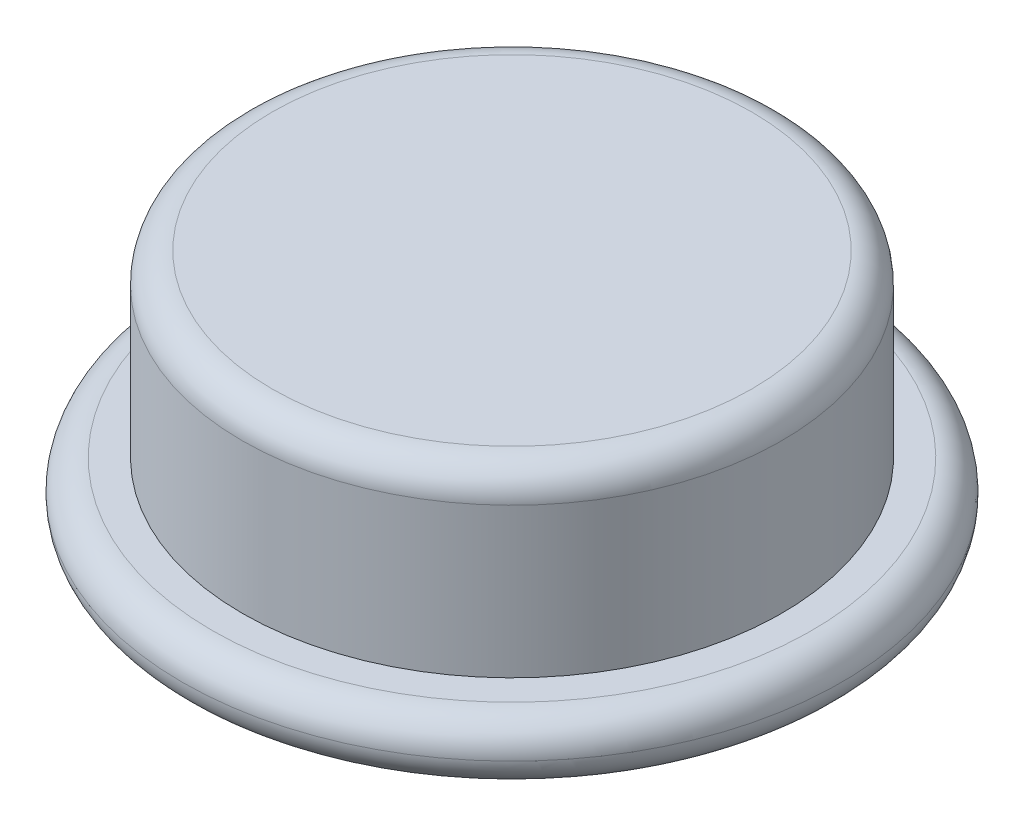
ISO-10303-21;
HEADER;
FILE_DESCRIPTION(('STEP AP214'),'2;1');
FILE_NAME('part.step','',(''),(''),'','','');
FILE_SCHEMA(('AUTOMOTIVE_DESIGN { 1 0 10303 214 1 1 1 1 }'));
ENDSEC;
DATA;
#1=APPLICATION_CONTEXT('core data for automotive mechanical design processes');
#2=APPLICATION_PROTOCOL_DEFINITION('international standard','automotive_design',2000,#1);
#3=PRODUCT_CONTEXT('',#1,'mechanical');
#4=PRODUCT('Part','Part','',(#3));
#5=PRODUCT_RELATED_PRODUCT_CATEGORY('part','',(#4));
#6=PRODUCT_DEFINITION_FORMATION('','',#4);
#7=PRODUCT_DEFINITION_CONTEXT('part definition',#1,'design');
#8=PRODUCT_DEFINITION('design','',#6,#7);
#9=PRODUCT_DEFINITION_SHAPE('','',#8);
#10=(LENGTH_UNIT() NAMED_UNIT(*) SI_UNIT(.MILLI.,.METRE.));
#11=(NAMED_UNIT(*) PLANE_ANGLE_UNIT() SI_UNIT($,.RADIAN.));
#12=(NAMED_UNIT(*) SI_UNIT($,.STERADIAN.) SOLID_ANGLE_UNIT());
#13=UNCERTAINTY_MEASURE_WITH_UNIT(LENGTH_MEASURE(1.E-05),#10,'distance_accuracy_value','');
#14=(GEOMETRIC_REPRESENTATION_CONTEXT(3) GLOBAL_UNCERTAINTY_ASSIGNED_CONTEXT((#13)) GLOBAL_UNIT_ASSIGNED_CONTEXT((#10,
#11,#12)) REPRESENTATION_CONTEXT('',''));
#15=CARTESIAN_POINT('',(0.,0.,0.));
#16=DIRECTION('',(0.,0.,1.));
#17=DIRECTION('',(1.,0.,0.));
#18=AXIS2_PLACEMENT_3D('',#15,#16,#17);
#19=CARTESIAN_POINT('',(0.,0.,5.5125));
#20=DIRECTION('',(0.,-1.,0.));
#21=DIRECTION('',(0.,0.,-1.));
#22=AXIS2_PLACEMENT_3D('',#19,#20,#21);
#23=PLANE('',#22);
#24=CARTESIAN_POINT('',(0.,0.,0.));
#25=DIRECTION('',(0.,-1.,0.));
#26=DIRECTION('',(0.,0.,-1.));
#27=AXIS2_PLACEMENT_3D('',#24,#25,#26);
#28=CIRCLE('',#27,5.0125);
#29=CARTESIAN_POINT('',(0.,0.,-5.0125));
#30=VERTEX_POINT('',#29);
#31=EDGE_CURVE('E48',#30,#30,#28,.T.);
#32=ORIENTED_EDGE('',*,*,#31,.T.);
#33=EDGE_LOOP('',(#32));
#34=FACE_BOUND('',#33,.T.);
#35=ADVANCED_FACE('F31',(#34),#23,.T.);
#36=CARTESIAN_POINT('',(0.,4.,0.));
#37=DIRECTION('',(0.,1.,0.));
#38=DIRECTION('',(0.,0.,1.));
#39=AXIS2_PLACEMENT_3D('',#36,#37,#38);
#40=PLANE('',#39);
#41=CARTESIAN_POINT('',(0.,4.,0.));
#42=DIRECTION('',(0.,1.,0.));
#43=DIRECTION('',(0.,0.,1.));
#44=AXIS2_PLACEMENT_3D('',#41,#42,#43);
#45=CIRCLE('',#44,4.0125);
#46=CARTESIAN_POINT('',(0.,4.,4.0125));
#47=VERTEX_POINT('',#46);
#48=EDGE_CURVE('E39',#47,#47,#45,.T.);
#49=ORIENTED_EDGE('',*,*,#48,.T.);
#50=EDGE_LOOP('',(#49));
#51=FACE_BOUND('',#50,.T.);
#52=ADVANCED_FACE('F75',(#51),#40,.T.);
#53=CARTESIAN_POINT('',(0.,0.,0.));
#54=DIRECTION('',(0.,1.,0.));
#55=DIRECTION('',(0.,0.,1.));
#56=AXIS2_PLACEMENT_3D('',#53,#54,#55);
#57=CYLINDRICAL_SURFACE('',#56,4.5125);
#58=CARTESIAN_POINT('',(0.,3.5,0.));
#59=DIRECTION('',(0.,1.,0.));
#60=DIRECTION('',(0.,0.,1.));
#61=AXIS2_PLACEMENT_3D('',#58,#59,#60);
#62=CIRCLE('',#61,4.5125);
#63=CARTESIAN_POINT('',(0.,3.5,4.5125));
#64=VERTEX_POINT('',#63);
#65=EDGE_CURVE('E10',#64,#64,#62,.F.);
#66=ORIENTED_EDGE('',*,*,#65,.T.);
#67=EDGE_LOOP('',(#66));
#68=FACE_BOUND('',#67,.T.);
#69=CARTESIAN_POINT('',(0.,0.999999999999999,0.));
#70=DIRECTION('',(0.,1.,0.));
#71=DIRECTION('',(0.,0.,1.));
#72=AXIS2_PLACEMENT_3D('',#69,#70,#71);
#73=CIRCLE('',#72,4.5125);
#74=CARTESIAN_POINT('',(0.,0.999999999999999,4.5125));
#75=VERTEX_POINT('',#74);
#76=EDGE_CURVE('E51',#75,#75,#73,.T.);
#77=ORIENTED_EDGE('',*,*,#76,.T.);
#78=EDGE_LOOP('',(#77));
#79=FACE_BOUND('',#78,.T.);
#80=ADVANCED_FACE('F70',(#68,#79),#57,.T.);
#81=CARTESIAN_POINT('',(0.,0.999999999999999,4.5125));
#82=DIRECTION('',(0.,1.,0.));
#83=DIRECTION('',(0.,0.,1.));
#84=AXIS2_PLACEMENT_3D('',#81,#82,#83);
#85=PLANE('',#84);
#86=CARTESIAN_POINT('',(0.,0.999999999999999,0.));
#87=DIRECTION('',(0.,1.,0.));
#88=DIRECTION('',(0.,0.,1.));
#89=AXIS2_PLACEMENT_3D('',#86,#87,#88);
#90=CIRCLE('',#89,5.0125);
#91=CARTESIAN_POINT('',(0.,0.999999999999999,5.0125));
#92=VERTEX_POINT('',#91);
#93=EDGE_CURVE('E43',#92,#92,#90,.T.);
#94=ORIENTED_EDGE('',*,*,#93,.T.);
#95=EDGE_LOOP('',(#94));
#96=FACE_BOUND('',#95,.T.);
#97=ORIENTED_EDGE('',*,*,#76,.F.);
#98=EDGE_LOOP('',(#97));
#99=FACE_BOUND('',#98,.T.);
#100=ADVANCED_FACE('F62',(#96,#99),#85,.T.);
#101=CARTESIAN_POINT('',(0.,0.499999999999999,0.));
#102=DIRECTION('',(0.,1.,0.));
#103=DIRECTION('',(0.,0.,1.));
#104=AXIS2_PLACEMENT_3D('',#101,#102,#103);
#105=TOROIDAL_SURFACE('',#104,5.0125,0.5);
#106=ORIENTED_EDGE('',*,*,#93,.F.);
#107=EDGE_LOOP('',(#106));
#108=FACE_BOUND('',#107,.T.);
#109=CARTESIAN_POINT('',(0.,0.499999999999999,0.));
#110=DIRECTION('',(0.,1.,0.));
#111=DIRECTION('',(0.,0.,1.));
#112=AXIS2_PLACEMENT_3D('',#109,#110,#111);
#113=CIRCLE('',#112,5.5125);
#114=CARTESIAN_POINT('',(0.,0.499999999999999,5.5125));
#115=VERTEX_POINT('',#114);
#116=EDGE_CURVE('E35',#115,#115,#113,.F.);
#117=ORIENTED_EDGE('',*,*,#116,.F.);
#118=EDGE_LOOP('',(#117));
#119=FACE_BOUND('',#118,.T.);
#120=ADVANCED_FACE('F60',(#108,#119),#105,.T.);
#121=CARTESIAN_POINT('',(0.,0.5,0.));
#122=DIRECTION('',(0.,-1.,0.));
#123=DIRECTION('',(0.,0.,-1.));
#124=AXIS2_PLACEMENT_3D('',#121,#122,#123);
#125=TOROIDAL_SURFACE('',#124,5.0125,0.5);
#126=ORIENTED_EDGE('',*,*,#31,.F.);
#127=EDGE_LOOP('',(#126));
#128=FACE_BOUND('',#127,.T.);
#129=ORIENTED_EDGE('',*,*,#116,.T.);
#130=EDGE_LOOP('',(#129));
#131=FACE_BOUND('',#130,.T.);
#132=ADVANCED_FACE('F58',(#128,#131),#125,.T.);
#133=CARTESIAN_POINT('',(0.,3.5,0.));
#134=DIRECTION('',(0.,1.,0.));
#135=DIRECTION('',(0.,0.,1.));
#136=AXIS2_PLACEMENT_3D('',#133,#134,#135);
#137=TOROIDAL_SURFACE('',#136,4.0125,0.5);
#138=ORIENTED_EDGE('',*,*,#65,.F.);
#139=EDGE_LOOP('',(#138));
#140=FACE_BOUND('',#139,.T.);
#141=ORIENTED_EDGE('',*,*,#48,.F.);
#142=EDGE_LOOP('',(#141));
#143=FACE_BOUND('',#142,.T.);
#144=ADVANCED_FACE('F33',(#140,#143),#137,.T.);
#145=CLOSED_SHELL('',(#35,#52,#80,#100,#120,#132,#144));
#146=MANIFOLD_SOLID_BREP('B2',#145);
#147=ADVANCED_BREP_SHAPE_REPRESENTATION('',(#18,#146),#14);
#148=SHAPE_DEFINITION_REPRESENTATION(#9,#147);
ENDSEC;
END-ISO-10303-21;
